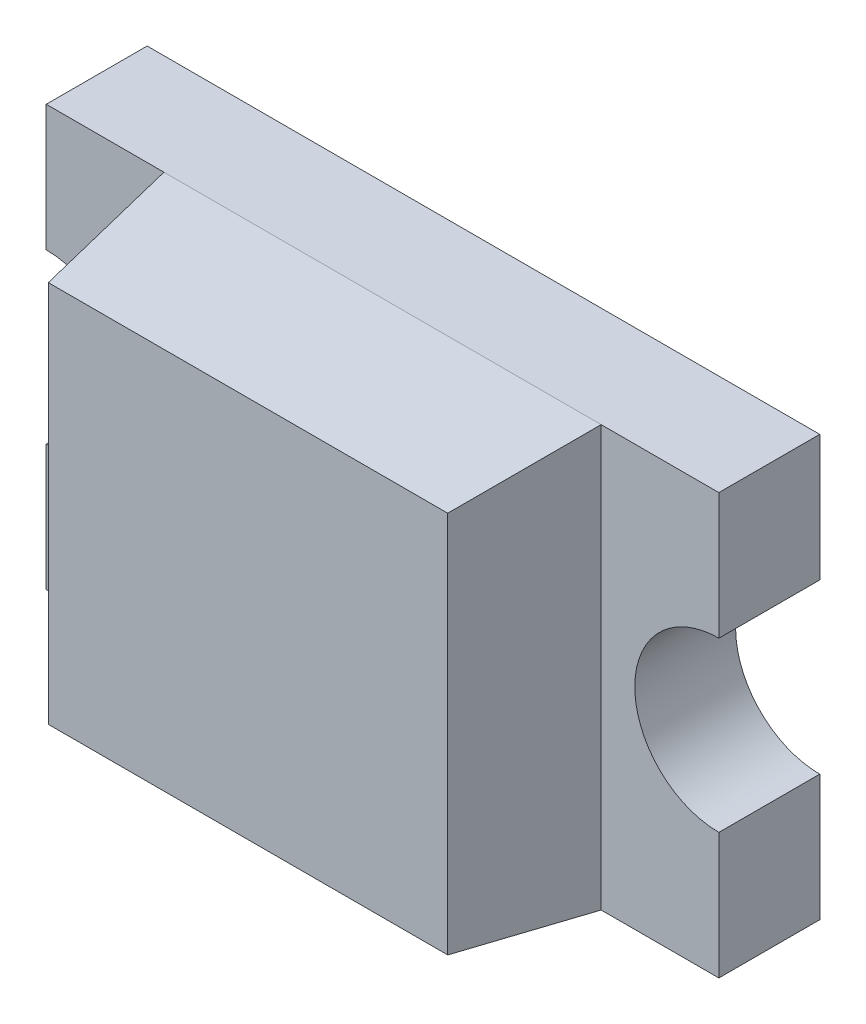
ISO-10303-21;
HEADER;
FILE_DESCRIPTION(('STEP AP214'),'2;1');
FILE_NAME('part.step','',(''),(''),'','','');
FILE_SCHEMA(('AUTOMOTIVE_DESIGN { 1 0 10303 214 1 1 1 1 }'));
ENDSEC;
DATA;
#1=APPLICATION_CONTEXT('core data for automotive mechanical design processes');
#2=APPLICATION_PROTOCOL_DEFINITION('international standard','automotive_design',2000,#1);
#3=PRODUCT_CONTEXT('',#1,'mechanical');
#4=PRODUCT('Part','Part','',(#3));
#5=PRODUCT_RELATED_PRODUCT_CATEGORY('part','',(#4));
#6=PRODUCT_DEFINITION_FORMATION('','',#4);
#7=PRODUCT_DEFINITION_CONTEXT('part definition',#1,'design');
#8=PRODUCT_DEFINITION('design','',#6,#7);
#9=PRODUCT_DEFINITION_SHAPE('','',#8);
#10=(LENGTH_UNIT() NAMED_UNIT(*) SI_UNIT(.MILLI.,.METRE.));
#11=(NAMED_UNIT(*) PLANE_ANGLE_UNIT() SI_UNIT($,.RADIAN.));
#12=(NAMED_UNIT(*) SI_UNIT($,.STERADIAN.) SOLID_ANGLE_UNIT());
#13=UNCERTAINTY_MEASURE_WITH_UNIT(LENGTH_MEASURE(1.E-05),#10,'distance_accuracy_value','');
#14=(GEOMETRIC_REPRESENTATION_CONTEXT(3) GLOBAL_UNCERTAINTY_ASSIGNED_CONTEXT((#13)) GLOBAL_UNIT_ASSIGNED_CONTEXT((#10,
#11,#12)) REPRESENTATION_CONTEXT('',''));
#15=CARTESIAN_POINT('',(0.,0.,0.));
#16=DIRECTION('',(0.,0.,1.));
#17=DIRECTION('',(1.,0.,0.));
#18=AXIS2_PLACEMENT_3D('',#15,#16,#17);
#19=CARTESIAN_POINT('',(-0.65139173101,0.635,0.290097319313));
#20=CARTESIAN_POINT('',(-0.592391935109,0.635,0.709902680687));
#21=CARTESIAN_POINT('',(-0.65139173101,-0.635,0.290097319313));
#22=CARTESIAN_POINT('',(-0.592391935109,-0.635,0.709902680687));
#23=(BOUNDED_SURFACE() B_SPLINE_SURFACE(1,1,((#19,#20),(#21,#22)),.UNSPECIFIED.,.F.,.F.,
.F.) B_SPLINE_SURFACE_WITH_KNOTS((2,2),(2,2),(-0.126,0.001),(-0.001,0.04139310290074),
.UNSPECIFIED.) GEOMETRIC_REPRESENTATION_ITEM() RATIONAL_B_SPLINE_SURFACE(((1.,1.),(1.,1.))) REPRESENTATION_ITEM('') SURFACE());
#24=CARTESIAN_POINT('',(-0.593783666119,-0.568783666119,0.7));
#25=CARTESIAN_POINT('',(-0.593783666119,0.568783666119,0.7));
#26=(BOUNDED_CURVE() B_SPLINE_CURVE(1,(#24,#25),.UNSPECIFIED.,.F.,
.F.) B_SPLINE_CURVE_WITH_KNOTS((2,2),(0.005621633388096,0.119378366612),
.UNSPECIFIED.) CURVE() GEOMETRIC_REPRESENTATION_ITEM() RATIONAL_B_SPLINE_CURVE((1.,1.)) REPRESENTATION_ITEM(''));
#27=CARTESIAN_POINT('',(-0.593783666119,-0.568783666119,0.7));
#28=VERTEX_POINT('',#27);
#29=CARTESIAN_POINT('',(-0.593783666119,0.568783666119,0.7));
#30=VERTEX_POINT('',#29);
#31=EDGE_CURVE('E381',#28,#30,#26,.T.);
#32=CARTESIAN_POINT('',(-0.65,0.625,0.3));
#33=CARTESIAN_POINT('',(-0.593783666119,0.568783666119,0.7));
#34=(BOUNDED_CURVE() B_SPLINE_CURVE(1,(#32,#33),.UNSPECIFIED.,.F.,
.F.) B_SPLINE_CURVE_WITH_KNOTS((2,2),(-0.008615283593227,0.03216713325399),
.UNSPECIFIED.) CURVE() GEOMETRIC_REPRESENTATION_ITEM() RATIONAL_B_SPLINE_CURVE((1.,1.)) REPRESENTATION_ITEM(''));
#35=CARTESIAN_POINT('',(-0.65,0.625,0.3));
#36=VERTEX_POINT('',#35);
#37=EDGE_CURVE('E11',#36,#30,#34,.T.);
#38=CARTESIAN_POINT('',(-0.65,-0.625,0.3));
#39=CARTESIAN_POINT('',(-0.65,0.625,0.3));
#40=(BOUNDED_CURVE() B_SPLINE_CURVE(1,(#38,#39),.UNSPECIFIED.,.F.,
.F.) B_SPLINE_CURVE_WITH_KNOTS((2,2),(-0.03125,0.09375),
.UNSPECIFIED.) CURVE() GEOMETRIC_REPRESENTATION_ITEM() RATIONAL_B_SPLINE_CURVE((1.,1.)) REPRESENTATION_ITEM(''));
#41=CARTESIAN_POINT('',(-0.65,-0.625,0.3));
#42=VERTEX_POINT('',#41);
#43=EDGE_CURVE('E130',#42,#36,#40,.T.);
#44=CARTESIAN_POINT('',(-0.65,-0.625,0.3));
#45=CARTESIAN_POINT('',(-0.593783666119,-0.568783666119,0.7));
#46=(BOUNDED_CURVE() B_SPLINE_CURVE(1,(#44,#45),.UNSPECIFIED.,.F.,
.F.) B_SPLINE_CURVE_WITH_KNOTS((2,2),(-0.008959894936956,0.03182252191026),
.UNSPECIFIED.) CURVE() GEOMETRIC_REPRESENTATION_ITEM() RATIONAL_B_SPLINE_CURVE((1.,1.)) REPRESENTATION_ITEM(''));
#47=EDGE_CURVE('E119',#42,#28,#46,.T.);
#48=ORIENTED_EDGE('',*,*,#31,.T.);
#49=ORIENTED_EDGE('',*,*,#37,.F.);
#50=ORIENTED_EDGE('',*,*,#43,.F.);
#51=ORIENTED_EDGE('',*,*,#47,.T.);
#52=EDGE_LOOP('',(#48,#49,#50,#51));
#53=FACE_BOUND('',#52,.T.);
#54=ADVANCED_FACE('F17',(#53),#23,.T.);
#55=CARTESIAN_POINT('',(0.66,0.62639173101,0.290097319313));
#56=CARTESIAN_POINT('',(0.66,0.567391935109,0.709902680687));
#57=CARTESIAN_POINT('',(-0.66,0.62639173101,0.290097319313));
#58=CARTESIAN_POINT('',(-0.66,0.567391935109,0.709902680687));
#59=(BOUNDED_SURFACE() B_SPLINE_SURFACE(1,1,((#55,#56),(#57,#58)),.UNSPECIFIED.,.F.,.F.,
.F.) B_SPLINE_SURFACE_WITH_KNOTS((2,2),(2,2),(-0.131,0.001),(-0.001,0.04139310290074),
.UNSPECIFIED.) GEOMETRIC_REPRESENTATION_ITEM() RATIONAL_B_SPLINE_SURFACE(((1.,1.),(1.,1.))) REPRESENTATION_ITEM('') SURFACE());
#60=CARTESIAN_POINT('',(-0.593783666119,0.568783666119,0.7));
#61=CARTESIAN_POINT('',(0.593783666119,0.568783666119,0.7));
#62=(BOUNDED_CURVE() B_SPLINE_CURVE(1,(#60,#61),.UNSPECIFIED.,.F.,
.F.) B_SPLINE_CURVE_WITH_KNOTS((2,2),(0.005621633388096,0.124378366612),
.UNSPECIFIED.) CURVE() GEOMETRIC_REPRESENTATION_ITEM() RATIONAL_B_SPLINE_CURVE((1.,1.)) REPRESENTATION_ITEM(''));
#63=CARTESIAN_POINT('',(0.593783666119,0.568783666119,0.7));
#64=VERTEX_POINT('',#63);
#65=EDGE_CURVE('E175',#30,#64,#62,.T.);
#66=CARTESIAN_POINT('',(0.65,0.625,0.3));
#67=CARTESIAN_POINT('',(0.593783666119,0.568783666119,0.7));
#68=(BOUNDED_CURVE() B_SPLINE_CURVE(1,(#66,#67),.UNSPECIFIED.,.F.,
.F.) B_SPLINE_CURVE_WITH_KNOTS((2,2),(-0.008959894936956,0.03182252191026),
.UNSPECIFIED.) CURVE() GEOMETRIC_REPRESENTATION_ITEM() RATIONAL_B_SPLINE_CURVE((1.,1.)) REPRESENTATION_ITEM(''));
#69=CARTESIAN_POINT('',(0.65,0.625,0.3));
#70=VERTEX_POINT('',#69);
#71=EDGE_CURVE('E23',#70,#64,#68,.T.);
#72=CARTESIAN_POINT('',(0.65,0.625,0.3));
#73=CARTESIAN_POINT('',(-0.65,0.625,0.3));
#74=(BOUNDED_CURVE() B_SPLINE_CURVE(1,(#72,#73),.UNSPECIFIED.,.F.,
.F.) B_SPLINE_CURVE_WITH_KNOTS((2,2),(0.035,0.165),
.UNSPECIFIED.) CURVE() GEOMETRIC_REPRESENTATION_ITEM() RATIONAL_B_SPLINE_CURVE((1.,1.)) REPRESENTATION_ITEM(''));
#75=EDGE_CURVE('E227',#70,#36,#74,.T.);
#76=ORIENTED_EDGE('',*,*,#65,.T.);
#77=ORIENTED_EDGE('',*,*,#71,.F.);
#78=ORIENTED_EDGE('',*,*,#75,.T.);
#79=ORIENTED_EDGE('',*,*,#37,.T.);
#80=EDGE_LOOP('',(#76,#77,#78,#79));
#81=FACE_BOUND('',#80,.T.);
#82=ADVANCED_FACE('F535',(#81),#59,.T.);
#83=CARTESIAN_POINT('',(0.65139173101,-0.635,0.290097319313));
#84=CARTESIAN_POINT('',(0.592391935109,-0.635,0.709902680687));
#85=CARTESIAN_POINT('',(0.65139173101,0.635,0.290097319313));
#86=CARTESIAN_POINT('',(0.592391935109,0.635,0.709902680687));
#87=(BOUNDED_SURFACE() B_SPLINE_SURFACE(1,1,((#83,#84),(#85,#86)),.UNSPECIFIED.,.F.,.F.,
.F.) B_SPLINE_SURFACE_WITH_KNOTS((2,2),(2,2),(-0.126,0.001),(-0.001,0.04139310290074),
.UNSPECIFIED.) GEOMETRIC_REPRESENTATION_ITEM() RATIONAL_B_SPLINE_SURFACE(((1.,1.),(1.,1.))) REPRESENTATION_ITEM('') SURFACE());
#88=CARTESIAN_POINT('',(0.593783666119,0.568783666119,0.7));
#89=CARTESIAN_POINT('',(0.593783666119,-0.568783666119,0.7));
#90=(BOUNDED_CURVE() B_SPLINE_CURVE(1,(#88,#89),.UNSPECIFIED.,.F.,
.F.) B_SPLINE_CURVE_WITH_KNOTS((2,2),(0.005621633388096,0.119378366612),
.UNSPECIFIED.) CURVE() GEOMETRIC_REPRESENTATION_ITEM() RATIONAL_B_SPLINE_CURVE((1.,1.)) REPRESENTATION_ITEM(''));
#91=CARTESIAN_POINT('',(0.593783666119,-0.568783666119,0.7));
#92=VERTEX_POINT('',#91);
#93=EDGE_CURVE('E113',#64,#92,#90,.T.);
#94=CARTESIAN_POINT('',(0.65,-0.625,0.3));
#95=CARTESIAN_POINT('',(0.593783666119,-0.568783666119,0.7));
#96=(BOUNDED_CURVE() B_SPLINE_CURVE(1,(#94,#95),.UNSPECIFIED.,.F.,
.F.) B_SPLINE_CURVE_WITH_KNOTS((2,2),(-0.008615283593227,0.03216713325399),
.UNSPECIFIED.) CURVE() GEOMETRIC_REPRESENTATION_ITEM() RATIONAL_B_SPLINE_CURVE((1.,1.)) REPRESENTATION_ITEM(''));
#97=CARTESIAN_POINT('',(0.65,-0.625,0.3));
#98=VERTEX_POINT('',#97);
#99=EDGE_CURVE('E107',#98,#92,#96,.T.);
#100=CARTESIAN_POINT('',(0.65,0.625,0.3));
#101=CARTESIAN_POINT('',(0.65,-0.625,0.3));
#102=(BOUNDED_CURVE() B_SPLINE_CURVE(1,(#100,#101),.UNSPECIFIED.,.F.,
.F.) B_SPLINE_CURVE_WITH_KNOTS((2,2),(-0.03125,0.09375),
.UNSPECIFIED.) CURVE() GEOMETRIC_REPRESENTATION_ITEM() RATIONAL_B_SPLINE_CURVE((1.,1.)) REPRESENTATION_ITEM(''));
#103=EDGE_CURVE('E110',#70,#98,#102,.T.);
#104=ORIENTED_EDGE('',*,*,#93,.T.);
#105=ORIENTED_EDGE('',*,*,#99,.F.);
#106=ORIENTED_EDGE('',*,*,#103,.F.);
#107=ORIENTED_EDGE('',*,*,#71,.T.);
#108=EDGE_LOOP('',(#104,#105,#106,#107));
#109=FACE_BOUND('',#108,.T.);
#110=ADVANCED_FACE('F109',(#109),#87,.T.);
#111=CARTESIAN_POINT('',(-0.66,-0.62639173101,0.290097319313));
#112=CARTESIAN_POINT('',(-0.66,-0.567391935109,0.709902680687));
#113=CARTESIAN_POINT('',(0.66,-0.62639173101,0.290097319313));
#114=CARTESIAN_POINT('',(0.66,-0.567391935109,0.709902680687));
#115=(BOUNDED_SURFACE() B_SPLINE_SURFACE(1,1,((#111,#112),(#113,#114)),.UNSPECIFIED.,.F.,.F.,
.F.) B_SPLINE_SURFACE_WITH_KNOTS((2,2),(2,2),(-0.131,0.001),(-0.001,0.04139310290074),
.UNSPECIFIED.) GEOMETRIC_REPRESENTATION_ITEM() RATIONAL_B_SPLINE_SURFACE(((1.,1.),(1.,1.))) REPRESENTATION_ITEM('') SURFACE());
#116=CARTESIAN_POINT('',(0.593783666119,-0.568783666119,0.7));
#117=CARTESIAN_POINT('',(-0.593783666119,-0.568783666119,0.7));
#118=(BOUNDED_CURVE() B_SPLINE_CURVE(1,(#116,#117),.UNSPECIFIED.,.F.,
.F.) B_SPLINE_CURVE_WITH_KNOTS((2,2),(0.005621633388096,0.124378366612),
.UNSPECIFIED.) CURVE() GEOMETRIC_REPRESENTATION_ITEM() RATIONAL_B_SPLINE_CURVE((1.,1.)) REPRESENTATION_ITEM(''));
#119=EDGE_CURVE('E332',#92,#28,#118,.T.);
#120=CARTESIAN_POINT('',(-0.65,-0.625,0.3));
#121=CARTESIAN_POINT('',(0.65,-0.625,0.3));
#122=(BOUNDED_CURVE() B_SPLINE_CURVE(1,(#120,#121),.UNSPECIFIED.,.F.,
.F.) B_SPLINE_CURVE_WITH_KNOTS((2,2),(0.035,0.165),
.UNSPECIFIED.) CURVE() GEOMETRIC_REPRESENTATION_ITEM() RATIONAL_B_SPLINE_CURVE((1.,1.)) REPRESENTATION_ITEM(''));
#123=EDGE_CURVE('E134',#42,#98,#122,.T.);
#124=ORIENTED_EDGE('',*,*,#119,.T.);
#125=ORIENTED_EDGE('',*,*,#47,.F.);
#126=ORIENTED_EDGE('',*,*,#123,.T.);
#127=ORIENTED_EDGE('',*,*,#99,.T.);
#128=EDGE_LOOP('',(#124,#125,#126,#127));
#129=FACE_BOUND('',#128,.T.);
#130=ADVANCED_FACE('F135',(#129),#115,.T.);
#131=CARTESIAN_POINT('',(0.603783666119,0.578783666119,0.7));
#132=CARTESIAN_POINT('',(0.603783666119,-0.578783666119,0.7));
#133=CARTESIAN_POINT('',(-0.603783666119,0.578783666119,0.7));
#134=CARTESIAN_POINT('',(-0.603783666119,-0.578783666119,0.7));
#135=(BOUNDED_SURFACE() B_SPLINE_SURFACE(1,1,((#131,#132),(#133,#134)),.UNSPECIFIED.,.F.,.F.,
.F.) B_SPLINE_SURFACE_WITH_KNOTS((2,2),(2,2),(-0.0603783666119,0.0603783666119),
(-0.0578783666119,0.0578783666119),
.UNSPECIFIED.) GEOMETRIC_REPRESENTATION_ITEM() RATIONAL_B_SPLINE_SURFACE(((1.,1.),(1.,1.))) REPRESENTATION_ITEM('') SURFACE());
#136=ORIENTED_EDGE('',*,*,#31,.F.);
#137=ORIENTED_EDGE('',*,*,#119,.F.);
#138=ORIENTED_EDGE('',*,*,#93,.F.);
#139=ORIENTED_EDGE('',*,*,#65,.F.);
#140=EDGE_LOOP('',(#136,#137,#138,#139));
#141=FACE_BOUND('',#140,.T.);
#142=ADVANCED_FACE('F492',(#141),#135,.T.);
#143=CARTESIAN_POINT('',(-1.01,-0.635,0.3));
#144=CARTESIAN_POINT('',(-1.01,0.635,0.3));
#145=CARTESIAN_POINT('',(-0.64,-0.635,0.3));
#146=CARTESIAN_POINT('',(-0.64,0.635,0.3));
#147=(BOUNDED_SURFACE() B_SPLINE_SURFACE(1,1,((#143,#144),(#145,#146)),.UNSPECIFIED.,.F.,.F.,
.F.) B_SPLINE_SURFACE_WITH_KNOTS((2,2),(2,2),(-0.101,-0.064),(-0.0635,0.0635),
.UNSPECIFIED.) GEOMETRIC_REPRESENTATION_ITEM() RATIONAL_B_SPLINE_SURFACE(((1.,1.),(1.,1.))) REPRESENTATION_ITEM('') SURFACE());
#148=CARTESIAN_POINT('',(-0.65,0.625,0.3));
#149=CARTESIAN_POINT('',(-1.,0.625,0.3));
#150=(BOUNDED_CURVE() B_SPLINE_CURVE(1,(#148,#149),.UNSPECIFIED.,.F.,
.F.) B_SPLINE_CURVE_WITH_KNOTS((2,2),(0.165,0.2),
.UNSPECIFIED.) CURVE() GEOMETRIC_REPRESENTATION_ITEM() RATIONAL_B_SPLINE_CURVE((1.,1.)) REPRESENTATION_ITEM(''));
#151=CARTESIAN_POINT('',(-1.,0.625,0.3));
#152=VERTEX_POINT('',#151);
#153=EDGE_CURVE('E236',#36,#152,#150,.T.);
#154=CARTESIAN_POINT('',(-1.,0.625,0.3));
#155=CARTESIAN_POINT('',(-1.,0.25,0.3));
#156=(BOUNDED_CURVE() B_SPLINE_CURVE(1,(#154,#155),.UNSPECIFIED.,.F.,
.F.) B_SPLINE_CURVE_WITH_KNOTS((2,2),(0.,0.0375),
.UNSPECIFIED.) CURVE() GEOMETRIC_REPRESENTATION_ITEM() RATIONAL_B_SPLINE_CURVE((1.,1.)) REPRESENTATION_ITEM(''));
#157=CARTESIAN_POINT('',(-1.,0.25,0.3));
#158=VERTEX_POINT('',#157);
#159=EDGE_CURVE('E185',#152,#158,#156,.T.);
#160=CARTESIAN_POINT('',(-1.,0.25,0.3));
#161=CARTESIAN_POINT('',(-0.75,0.25,0.3));
#162=CARTESIAN_POINT('',(-0.75,0.,0.3));
#163=CARTESIAN_POINT('',(-0.75,-0.25,0.3));
#164=CARTESIAN_POINT('',(-1.,-0.25,0.3));
#165=(BOUNDED_CURVE() B_SPLINE_CURVE(2,(#160,#161,#162,#163,#164),.UNSPECIFIED.,.F.,
.F.) B_SPLINE_CURVE_WITH_KNOTS((3,2,3),(-3.14159265359,-1.570796326795,0.),
.UNSPECIFIED.) CURVE() GEOMETRIC_REPRESENTATION_ITEM() RATIONAL_B_SPLINE_CURVE((1.,
0.707106781187,1.,0.707106781187,1.)) REPRESENTATION_ITEM(''));
#166=CARTESIAN_POINT('',(-1.,-0.25,0.3));
#167=VERTEX_POINT('',#166);
#168=EDGE_CURVE('E156',#158,#167,#165,.T.);
#169=CARTESIAN_POINT('',(-1.,-0.25,0.3));
#170=CARTESIAN_POINT('',(-1.,-0.625,0.3));
#171=(BOUNDED_CURVE() B_SPLINE_CURVE(1,(#169,#170),.UNSPECIFIED.,.F.,
.F.) B_SPLINE_CURVE_WITH_KNOTS((2,2),(0.,0.0375),
.UNSPECIFIED.) CURVE() GEOMETRIC_REPRESENTATION_ITEM() RATIONAL_B_SPLINE_CURVE((1.,1.)) REPRESENTATION_ITEM(''));
#172=CARTESIAN_POINT('',(-1.,-0.625,0.3));
#173=VERTEX_POINT('',#172);
#174=EDGE_CURVE('E150',#167,#173,#171,.T.);
#175=CARTESIAN_POINT('',(-1.,-0.625,0.3));
#176=CARTESIAN_POINT('',(-0.65,-0.625,0.3));
#177=(BOUNDED_CURVE() B_SPLINE_CURVE(1,(#175,#176),.UNSPECIFIED.,.F.,
.F.) B_SPLINE_CURVE_WITH_KNOTS((2,2),(0.,0.035),
.UNSPECIFIED.) CURVE() GEOMETRIC_REPRESENTATION_ITEM() RATIONAL_B_SPLINE_CURVE((1.,1.)) REPRESENTATION_ITEM(''));
#178=EDGE_CURVE('E140',#173,#42,#177,.T.);
#179=ORIENTED_EDGE('',*,*,#43,.T.);
#180=ORIENTED_EDGE('',*,*,#153,.T.);
#181=ORIENTED_EDGE('',*,*,#159,.T.);
#182=ORIENTED_EDGE('',*,*,#168,.T.);
#183=ORIENTED_EDGE('',*,*,#174,.T.);
#184=ORIENTED_EDGE('',*,*,#178,.T.);
#185=EDGE_LOOP('',(#179,#180,#181,#182,#183,#184));
#186=FACE_BOUND('',#185,.T.);
#187=ADVANCED_FACE('F19',(#186),#147,.T.);
#188=CARTESIAN_POINT('',(0.64,-0.635,0.3));
#189=CARTESIAN_POINT('',(0.64,0.635,0.3));
#190=CARTESIAN_POINT('',(1.01,-0.635,0.3));
#191=CARTESIAN_POINT('',(1.01,0.635,0.3));
#192=(BOUNDED_SURFACE() B_SPLINE_SURFACE(1,1,((#188,#189),(#190,#191)),.UNSPECIFIED.,.F.,.F.,
.F.) B_SPLINE_SURFACE_WITH_KNOTS((2,2),(2,2),(0.064,0.101),(-0.0635,0.0635),
.UNSPECIFIED.) GEOMETRIC_REPRESENTATION_ITEM() RATIONAL_B_SPLINE_SURFACE(((1.,1.),(1.,1.))) REPRESENTATION_ITEM('') SURFACE());
#193=CARTESIAN_POINT('',(0.65,-0.625,0.3));
#194=CARTESIAN_POINT('',(1.,-0.625,0.3));
#195=(BOUNDED_CURVE() B_SPLINE_CURVE(1,(#193,#194),.UNSPECIFIED.,.F.,
.F.) B_SPLINE_CURVE_WITH_KNOTS((2,2),(0.165,0.2),
.UNSPECIFIED.) CURVE() GEOMETRIC_REPRESENTATION_ITEM() RATIONAL_B_SPLINE_CURVE((1.,1.)) REPRESENTATION_ITEM(''));
#196=CARTESIAN_POINT('',(1.,-0.625,0.3));
#197=VERTEX_POINT('',#196);
#198=EDGE_CURVE('E124',#98,#197,#195,.T.);
#199=CARTESIAN_POINT('',(1.,-0.625,0.3));
#200=CARTESIAN_POINT('',(1.,-0.25,0.3));
#201=(BOUNDED_CURVE() B_SPLINE_CURVE(1,(#199,#200),.UNSPECIFIED.,.F.,
.F.) B_SPLINE_CURVE_WITH_KNOTS((2,2),(0.,0.0375),
.UNSPECIFIED.) CURVE() GEOMETRIC_REPRESENTATION_ITEM() RATIONAL_B_SPLINE_CURVE((1.,1.)) REPRESENTATION_ITEM(''));
#202=CARTESIAN_POINT('',(1.,-0.25,0.3));
#203=VERTEX_POINT('',#202);
#204=EDGE_CURVE('E102',#197,#203,#201,.T.);
#205=CARTESIAN_POINT('',(1.,-0.25,0.3));
#206=CARTESIAN_POINT('',(0.75,-0.25,0.3));
#207=CARTESIAN_POINT('',(0.75,0.,0.3));
#208=CARTESIAN_POINT('',(0.75,0.25,0.3));
#209=CARTESIAN_POINT('',(1.,0.25,0.3));
#210=(BOUNDED_CURVE() B_SPLINE_CURVE(2,(#205,#206,#207,#208,#209),.UNSPECIFIED.,.F.,
.F.) B_SPLINE_CURVE_WITH_KNOTS((3,2,3),(-3.14159265359,-1.570796326795,0.),
.UNSPECIFIED.) CURVE() GEOMETRIC_REPRESENTATION_ITEM() RATIONAL_B_SPLINE_CURVE((1.,
0.707106781187,1.,0.707106781187,1.)) REPRESENTATION_ITEM(''));
#211=CARTESIAN_POINT('',(1.,0.25,0.3));
#212=VERTEX_POINT('',#211);
#213=EDGE_CURVE('E131',#203,#212,#210,.T.);
#214=CARTESIAN_POINT('',(1.,0.25,0.3));
#215=CARTESIAN_POINT('',(1.,0.625,0.3));
#216=(BOUNDED_CURVE() B_SPLINE_CURVE(1,(#214,#215),.UNSPECIFIED.,.F.,
.F.) B_SPLINE_CURVE_WITH_KNOTS((2,2),(0.,0.0375),
.UNSPECIFIED.) CURVE() GEOMETRIC_REPRESENTATION_ITEM() RATIONAL_B_SPLINE_CURVE((1.,1.)) REPRESENTATION_ITEM(''));
#217=CARTESIAN_POINT('',(1.,0.625,0.3));
#218=VERTEX_POINT('',#217);
#219=EDGE_CURVE('E205',#212,#218,#216,.T.);
#220=CARTESIAN_POINT('',(1.,0.625,0.3));
#221=CARTESIAN_POINT('',(0.65,0.625,0.3));
#222=(BOUNDED_CURVE() B_SPLINE_CURVE(1,(#220,#221),.UNSPECIFIED.,.F.,
.F.) B_SPLINE_CURVE_WITH_KNOTS((2,2),(0.,0.035),
.UNSPECIFIED.) CURVE() GEOMETRIC_REPRESENTATION_ITEM() RATIONAL_B_SPLINE_CURVE((1.,1.)) REPRESENTATION_ITEM(''));
#223=EDGE_CURVE('E127',#218,#70,#222,.T.);
#224=ORIENTED_EDGE('',*,*,#103,.T.);
#225=ORIENTED_EDGE('',*,*,#198,.T.);
#226=ORIENTED_EDGE('',*,*,#204,.T.);
#227=ORIENTED_EDGE('',*,*,#213,.T.);
#228=ORIENTED_EDGE('',*,*,#219,.T.);
#229=ORIENTED_EDGE('',*,*,#223,.T.);
#230=EDGE_LOOP('',(#224,#225,#226,#227,#228,#229));
#231=FACE_BOUND('',#230,.T.);
#232=ADVANCED_FACE('F122',(#231),#192,.T.);
#233=CARTESIAN_POINT('',(1.,0.25,0.));
#234=CARTESIAN_POINT('',(0.75,0.25,0.));
#235=CARTESIAN_POINT('',(0.75,0.,0.));
#236=CARTESIAN_POINT('',(0.75,-0.25,0.));
#237=CARTESIAN_POINT('',(1.,-0.25,0.));
#238=CARTESIAN_POINT('',(1.,0.25,0.3));
#239=CARTESIAN_POINT('',(0.75,0.25,0.3));
#240=CARTESIAN_POINT('',(0.75,0.,0.3));
#241=CARTESIAN_POINT('',(0.75,-0.25,0.3));
#242=CARTESIAN_POINT('',(1.,-0.25,0.3));
#243=(BOUNDED_SURFACE() B_SPLINE_SURFACE(1,2,((#233,#234,#235,#236,#237),(#238,#239,#240,#241,
#242)),.UNSPECIFIED.,.F.,.F.,.F.) B_SPLINE_SURFACE_WITH_KNOTS((2,2),(3,2,3),(0.,1.2),(0.,
1.570796326795,3.14159265359),
.UNSPECIFIED.) GEOMETRIC_REPRESENTATION_ITEM() RATIONAL_B_SPLINE_SURFACE(((1.,0.707106781187,1.,
0.707106781187,1.),(1.,0.707106781187,1.,0.707106781187,1.))) REPRESENTATION_ITEM('') SURFACE());
#244=CARTESIAN_POINT('',(1.,0.25,0.));
#245=CARTESIAN_POINT('',(0.75,0.25,0.));
#246=CARTESIAN_POINT('',(0.75,0.,0.));
#247=CARTESIAN_POINT('',(0.75,-0.25,0.));
#248=CARTESIAN_POINT('',(1.,-0.25,0.));
#249=(BOUNDED_CURVE() B_SPLINE_CURVE(2,(#244,#245,#246,#247,#248),.UNSPECIFIED.,.F.,
.F.) B_SPLINE_CURVE_WITH_KNOTS((3,2,3),(0.,1.570796326795,3.14159265359),
.UNSPECIFIED.) CURVE() GEOMETRIC_REPRESENTATION_ITEM() RATIONAL_B_SPLINE_CURVE((1.,
0.707106781187,1.,0.707106781187,1.)) REPRESENTATION_ITEM(''));
#250=CARTESIAN_POINT('',(1.,0.25,0.));
#251=VERTEX_POINT('',#250);
#252=CARTESIAN_POINT('',(1.,-0.25,0.));
#253=VERTEX_POINT('',#252);
#254=EDGE_CURVE('E196',#251,#253,#249,.T.);
#255=CARTESIAN_POINT('',(1.,0.25,0.));
#256=CARTESIAN_POINT('',(1.,0.25,0.3));
#257=(BOUNDED_CURVE() B_SPLINE_CURVE(1,(#255,#256),.UNSPECIFIED.,.F.,
.F.) B_SPLINE_CURVE_WITH_KNOTS((2,2),(0.,0.03),
.UNSPECIFIED.) CURVE() GEOMETRIC_REPRESENTATION_ITEM() RATIONAL_B_SPLINE_CURVE((1.,1.)) REPRESENTATION_ITEM(''));
#258=EDGE_CURVE('E254',#251,#212,#257,.T.);
#259=CARTESIAN_POINT('',(1.,-0.25,0.));
#260=CARTESIAN_POINT('',(1.,-0.25,0.3));
#261=(BOUNDED_CURVE() B_SPLINE_CURVE(1,(#259,#260),.UNSPECIFIED.,.F.,
.F.) B_SPLINE_CURVE_WITH_KNOTS((2,2),(0.,0.03),
.UNSPECIFIED.) CURVE() GEOMETRIC_REPRESENTATION_ITEM() RATIONAL_B_SPLINE_CURVE((1.,1.)) REPRESENTATION_ITEM(''));
#262=EDGE_CURVE('E167',#253,#203,#261,.T.);
#263=ORIENTED_EDGE('',*,*,#254,.F.);
#264=ORIENTED_EDGE('',*,*,#258,.T.);
#265=ORIENTED_EDGE('',*,*,#213,.F.);
#266=ORIENTED_EDGE('',*,*,#262,.F.);
#267=EDGE_LOOP('',(#263,#264,#265,#266));
#268=FACE_BOUND('',#267,.T.);
#269=ADVANCED_FACE('F504',(#268),#243,.T.);
#270=CARTESIAN_POINT('',(1.,-0.635,-0.01));
#271=CARTESIAN_POINT('',(1.,-0.635,0.31));
#272=CARTESIAN_POINT('',(1.,-0.24,-0.01));
#273=CARTESIAN_POINT('',(1.,-0.24,0.31));
#274=(BOUNDED_SURFACE() B_SPLINE_SURFACE(1,1,((#270,#271),(#272,#273)),.UNSPECIFIED.,.F.,.F.,
.F.) B_SPLINE_SURFACE_WITH_KNOTS((2,2),(2,2),(-0.001,0.0385),(-0.001,0.031),
.UNSPECIFIED.) GEOMETRIC_REPRESENTATION_ITEM() RATIONAL_B_SPLINE_SURFACE(((1.,1.),(1.,1.))) REPRESENTATION_ITEM('') SURFACE());
#275=CARTESIAN_POINT('',(1.,-0.625,0.));
#276=CARTESIAN_POINT('',(1.,-0.25,0.));
#277=(BOUNDED_CURVE() B_SPLINE_CURVE(1,(#275,#276),.UNSPECIFIED.,.F.,
.F.) B_SPLINE_CURVE_WITH_KNOTS((2,2),(0.,0.0375),
.UNSPECIFIED.) CURVE() GEOMETRIC_REPRESENTATION_ITEM() RATIONAL_B_SPLINE_CURVE((1.,1.)) REPRESENTATION_ITEM(''));
#278=CARTESIAN_POINT('',(1.,-0.625,0.));
#279=VERTEX_POINT('',#278);
#280=EDGE_CURVE('E186',#279,#253,#277,.T.);
#281=CARTESIAN_POINT('',(1.,-0.625,0.));
#282=CARTESIAN_POINT('',(1.,-0.625,0.3));
#283=(BOUNDED_CURVE() B_SPLINE_CURVE(1,(#281,#282),.UNSPECIFIED.,.F.,
.F.) B_SPLINE_CURVE_WITH_KNOTS((2,2),(0.,0.03),
.UNSPECIFIED.) CURVE() GEOMETRIC_REPRESENTATION_ITEM() RATIONAL_B_SPLINE_CURVE((1.,1.)) REPRESENTATION_ITEM(''));
#284=EDGE_CURVE('E143',#279,#197,#283,.T.);
#285=ORIENTED_EDGE('',*,*,#280,.T.);
#286=ORIENTED_EDGE('',*,*,#262,.T.);
#287=ORIENTED_EDGE('',*,*,#204,.F.);
#288=ORIENTED_EDGE('',*,*,#284,.F.);
#289=EDGE_LOOP('',(#285,#286,#287,#288));
#290=FACE_BOUND('',#289,.T.);
#291=ADVANCED_FACE('F500',(#290),#274,.T.);
#292=CARTESIAN_POINT('',(-1.01,-0.625,-0.01));
#293=CARTESIAN_POINT('',(-1.01,-0.625,0.31));
#294=CARTESIAN_POINT('',(1.01,-0.625,-0.01));
#295=CARTESIAN_POINT('',(1.01,-0.625,0.31));
#296=(BOUNDED_SURFACE() B_SPLINE_SURFACE(1,1,((#292,#293),(#294,#295)),.UNSPECIFIED.,.F.,.F.,
.F.) B_SPLINE_SURFACE_WITH_KNOTS((2,2),(2,2),(-0.001,0.201),(-0.001,0.031),
.UNSPECIFIED.) GEOMETRIC_REPRESENTATION_ITEM() RATIONAL_B_SPLINE_SURFACE(((1.,1.),(1.,1.))) REPRESENTATION_ITEM('') SURFACE());
#297=CARTESIAN_POINT('',(-1.,-0.625,0.));
#298=CARTESIAN_POINT('',(1.,-0.625,0.));
#299=(BOUNDED_CURVE() B_SPLINE_CURVE(1,(#297,#298),.UNSPECIFIED.,.F.,
.F.) B_SPLINE_CURVE_WITH_KNOTS((2,2),(0.,0.2),
.UNSPECIFIED.) CURVE() GEOMETRIC_REPRESENTATION_ITEM() RATIONAL_B_SPLINE_CURVE((1.,1.)) REPRESENTATION_ITEM(''));
#300=CARTESIAN_POINT('',(-1.,-0.625,0.));
#301=VERTEX_POINT('',#300);
#302=EDGE_CURVE('E195',#301,#279,#299,.T.);
#303=CARTESIAN_POINT('',(-1.,-0.625,0.));
#304=CARTESIAN_POINT('',(-1.,-0.625,0.3));
#305=(BOUNDED_CURVE() B_SPLINE_CURVE(1,(#303,#304),.UNSPECIFIED.,.F.,
.F.) B_SPLINE_CURVE_WITH_KNOTS((2,2),(0.,0.03),
.UNSPECIFIED.) CURVE() GEOMETRIC_REPRESENTATION_ITEM() RATIONAL_B_SPLINE_CURVE((1.,1.)) REPRESENTATION_ITEM(''));
#306=EDGE_CURVE('E226',#301,#173,#305,.T.);
#307=ORIENTED_EDGE('',*,*,#302,.T.);
#308=ORIENTED_EDGE('',*,*,#284,.T.);
#309=ORIENTED_EDGE('',*,*,#198,.F.);
#310=ORIENTED_EDGE('',*,*,#123,.F.);
#311=ORIENTED_EDGE('',*,*,#178,.F.);
#312=ORIENTED_EDGE('',*,*,#306,.F.);
#313=EDGE_LOOP('',(#307,#308,#309,#310,#311,#312));
#314=FACE_BOUND('',#313,.T.);
#315=ADVANCED_FACE('F142',(#314),#296,.T.);
#316=CARTESIAN_POINT('',(-1.,-0.24,-0.01));
#317=CARTESIAN_POINT('',(-1.,-0.24,0.31));
#318=CARTESIAN_POINT('',(-1.,-0.635,-0.01));
#319=CARTESIAN_POINT('',(-1.,-0.635,0.31));
#320=(BOUNDED_SURFACE() B_SPLINE_SURFACE(1,1,((#316,#317),(#318,#319)),.UNSPECIFIED.,.F.,.F.,
.F.) B_SPLINE_SURFACE_WITH_KNOTS((2,2),(2,2),(-0.001,0.0385),(-0.001,0.031),
.UNSPECIFIED.) GEOMETRIC_REPRESENTATION_ITEM() RATIONAL_B_SPLINE_SURFACE(((1.,1.),(1.,1.))) REPRESENTATION_ITEM('') SURFACE());
#321=CARTESIAN_POINT('',(-1.,-0.25,0.));
#322=CARTESIAN_POINT('',(-1.,-0.625,0.));
#323=(BOUNDED_CURVE() B_SPLINE_CURVE(1,(#321,#322),.UNSPECIFIED.,.F.,
.F.) B_SPLINE_CURVE_WITH_KNOTS((2,2),(0.,0.0375),
.UNSPECIFIED.) CURVE() GEOMETRIC_REPRESENTATION_ITEM() RATIONAL_B_SPLINE_CURVE((1.,1.)) REPRESENTATION_ITEM(''));
#324=CARTESIAN_POINT('',(-1.,-0.25,0.));
#325=VERTEX_POINT('',#324);
#326=EDGE_CURVE('E244',#325,#301,#323,.T.);
#327=CARTESIAN_POINT('',(-1.,-0.25,0.));
#328=CARTESIAN_POINT('',(-1.,-0.25,0.3));
#329=(BOUNDED_CURVE() B_SPLINE_CURVE(1,(#327,#328),.UNSPECIFIED.,.F.,
.F.) B_SPLINE_CURVE_WITH_KNOTS((2,2),(0.,0.03),
.UNSPECIFIED.) CURVE() GEOMETRIC_REPRESENTATION_ITEM() RATIONAL_B_SPLINE_CURVE((1.,1.)) REPRESENTATION_ITEM(''));
#330=EDGE_CURVE('E176',#325,#167,#329,.T.);
#331=ORIENTED_EDGE('',*,*,#326,.T.);
#332=ORIENTED_EDGE('',*,*,#306,.T.);
#333=ORIENTED_EDGE('',*,*,#174,.F.);
#334=ORIENTED_EDGE('',*,*,#330,.F.);
#335=EDGE_LOOP('',(#331,#332,#333,#334));
#336=FACE_BOUND('',#335,.T.);
#337=ADVANCED_FACE('F445',(#336),#320,.T.);
#338=CARTESIAN_POINT('',(-1.,-0.25,0.));
#339=CARTESIAN_POINT('',(-0.75,-0.25,0.));
#340=CARTESIAN_POINT('',(-0.75,0.,0.));
#341=CARTESIAN_POINT('',(-0.75,0.25,0.));
#342=CARTESIAN_POINT('',(-1.,0.25,0.));
#343=CARTESIAN_POINT('',(-1.,-0.25,0.3));
#344=CARTESIAN_POINT('',(-0.75,-0.25,0.3));
#345=CARTESIAN_POINT('',(-0.75,0.,0.3));
#346=CARTESIAN_POINT('',(-0.75,0.25,0.3));
#347=CARTESIAN_POINT('',(-1.,0.25,0.3));
#348=(BOUNDED_SURFACE() B_SPLINE_SURFACE(1,2,((#338,#339,#340,#341,#342),(#343,#344,#345,#346,
#347)),.UNSPECIFIED.,.F.,.F.,.F.) B_SPLINE_SURFACE_WITH_KNOTS((2,2),(3,2,3),(0.,1.2),(0.,
1.570796326795,3.14159265359),
.UNSPECIFIED.) GEOMETRIC_REPRESENTATION_ITEM() RATIONAL_B_SPLINE_SURFACE(((1.,0.707106781187,1.,
0.707106781187,1.),(1.,0.707106781187,1.,0.707106781187,1.))) REPRESENTATION_ITEM('') SURFACE());
#349=CARTESIAN_POINT('',(-1.,-0.25,0.));
#350=CARTESIAN_POINT('',(-0.75,-0.25,0.));
#351=CARTESIAN_POINT('',(-0.75,0.,0.));
#352=CARTESIAN_POINT('',(-0.75,0.25,0.));
#353=CARTESIAN_POINT('',(-1.,0.25,0.));
#354=(BOUNDED_CURVE() B_SPLINE_CURVE(2,(#349,#350,#351,#352,#353),.UNSPECIFIED.,.F.,
.F.) B_SPLINE_CURVE_WITH_KNOTS((3,2,3),(0.,1.570796326795,3.14159265359),
.UNSPECIFIED.) CURVE() GEOMETRIC_REPRESENTATION_ITEM() RATIONAL_B_SPLINE_CURVE((1.,
0.707106781187,1.,0.707106781187,1.)) REPRESENTATION_ITEM(''));
#355=CARTESIAN_POINT('',(-1.,0.25,0.));
#356=VERTEX_POINT('',#355);
#357=EDGE_CURVE('E347',#325,#356,#354,.T.);
#358=CARTESIAN_POINT('',(-1.,0.25,0.));
#359=CARTESIAN_POINT('',(-1.,0.25,0.3));
#360=(BOUNDED_CURVE() B_SPLINE_CURVE(1,(#358,#359),.UNSPECIFIED.,.F.,
.F.) B_SPLINE_CURVE_WITH_KNOTS((2,2),(0.,0.03),
.UNSPECIFIED.) CURVE() GEOMETRIC_REPRESENTATION_ITEM() RATIONAL_B_SPLINE_CURVE((1.,1.)) REPRESENTATION_ITEM(''));
#361=EDGE_CURVE('E245',#356,#158,#360,.T.);
#362=ORIENTED_EDGE('',*,*,#357,.F.);
#363=ORIENTED_EDGE('',*,*,#330,.T.);
#364=ORIENTED_EDGE('',*,*,#168,.F.);
#365=ORIENTED_EDGE('',*,*,#361,.F.);
#366=EDGE_LOOP('',(#362,#363,#364,#365));
#367=FACE_BOUND('',#366,.T.);
#368=ADVANCED_FACE('F513',(#367),#348,.T.);
#369=CARTESIAN_POINT('',(-1.,0.635,-0.01));
#370=CARTESIAN_POINT('',(-1.,0.635,0.31));
#371=CARTESIAN_POINT('',(-1.,0.24,-0.01));
#372=CARTESIAN_POINT('',(-1.,0.24,0.31));
#373=(BOUNDED_SURFACE() B_SPLINE_SURFACE(1,1,((#369,#370),(#371,#372)),.UNSPECIFIED.,.F.,.F.,
.F.) B_SPLINE_SURFACE_WITH_KNOTS((2,2),(2,2),(-0.001,0.0385),(-0.001,0.031),
.UNSPECIFIED.) GEOMETRIC_REPRESENTATION_ITEM() RATIONAL_B_SPLINE_SURFACE(((1.,1.),(1.,1.))) REPRESENTATION_ITEM('') SURFACE());
#374=CARTESIAN_POINT('',(-1.,0.625,0.));
#375=CARTESIAN_POINT('',(-1.,0.25,0.));
#376=(BOUNDED_CURVE() B_SPLINE_CURVE(1,(#374,#375),.UNSPECIFIED.,.F.,
.F.) B_SPLINE_CURVE_WITH_KNOTS((2,2),(0.,0.0375),
.UNSPECIFIED.) CURVE() GEOMETRIC_REPRESENTATION_ITEM() RATIONAL_B_SPLINE_CURVE((1.,1.)) REPRESENTATION_ITEM(''));
#377=CARTESIAN_POINT('',(-1.,0.625,0.));
#378=VERTEX_POINT('',#377);
#379=EDGE_CURVE('E356',#378,#356,#376,.T.);
#380=CARTESIAN_POINT('',(-1.,0.625,0.));
#381=CARTESIAN_POINT('',(-1.,0.625,0.3));
#382=(BOUNDED_CURVE() B_SPLINE_CURVE(1,(#380,#381),.UNSPECIFIED.,.F.,
.F.) B_SPLINE_CURVE_WITH_KNOTS((2,2),(0.,0.03),
.UNSPECIFIED.) CURVE() GEOMETRIC_REPRESENTATION_ITEM() RATIONAL_B_SPLINE_CURVE((1.,1.)) REPRESENTATION_ITEM(''));
#383=EDGE_CURVE('E263',#378,#152,#382,.T.);
#384=ORIENTED_EDGE('',*,*,#379,.T.);
#385=ORIENTED_EDGE('',*,*,#361,.T.);
#386=ORIENTED_EDGE('',*,*,#159,.F.);
#387=ORIENTED_EDGE('',*,*,#383,.F.);
#388=EDGE_LOOP('',(#384,#385,#386,#387));
#389=FACE_BOUND('',#388,.T.);
#390=ADVANCED_FACE('F520',(#389),#373,.T.);
#391=CARTESIAN_POINT('',(1.01,0.625,-0.01));
#392=CARTESIAN_POINT('',(1.01,0.625,0.31));
#393=CARTESIAN_POINT('',(-1.01,0.625,-0.01));
#394=CARTESIAN_POINT('',(-1.01,0.625,0.31));
#395=(BOUNDED_SURFACE() B_SPLINE_SURFACE(1,1,((#391,#392),(#393,#394)),.UNSPECIFIED.,.F.,.F.,
.F.) B_SPLINE_SURFACE_WITH_KNOTS((2,2),(2,2),(-0.001,0.201),(-0.001,0.031),
.UNSPECIFIED.) GEOMETRIC_REPRESENTATION_ITEM() RATIONAL_B_SPLINE_SURFACE(((1.,1.),(1.,1.))) REPRESENTATION_ITEM('') SURFACE());
#396=CARTESIAN_POINT('',(1.,0.625,0.));
#397=CARTESIAN_POINT('',(-1.,0.625,0.));
#398=(BOUNDED_CURVE() B_SPLINE_CURVE(1,(#396,#397),.UNSPECIFIED.,.F.,
.F.) B_SPLINE_CURVE_WITH_KNOTS((2,2),(0.,0.2),
.UNSPECIFIED.) CURVE() GEOMETRIC_REPRESENTATION_ITEM() RATIONAL_B_SPLINE_CURVE((1.,1.)) REPRESENTATION_ITEM(''));
#399=CARTESIAN_POINT('',(1.,0.625,0.));
#400=VERTEX_POINT('',#399);
#401=EDGE_CURVE('E206',#400,#378,#398,.T.);
#402=CARTESIAN_POINT('',(1.,0.625,0.));
#403=CARTESIAN_POINT('',(1.,0.625,0.3));
#404=(BOUNDED_CURVE() B_SPLINE_CURVE(1,(#402,#403),.UNSPECIFIED.,.F.,
.F.) B_SPLINE_CURVE_WITH_KNOTS((2,2),(0.,0.03),
.UNSPECIFIED.) CURVE() GEOMETRIC_REPRESENTATION_ITEM() RATIONAL_B_SPLINE_CURVE((1.,1.)) REPRESENTATION_ITEM(''));
#405=EDGE_CURVE('E197',#400,#218,#404,.T.);
#406=ORIENTED_EDGE('',*,*,#401,.T.);
#407=ORIENTED_EDGE('',*,*,#383,.T.);
#408=ORIENTED_EDGE('',*,*,#153,.F.);
#409=ORIENTED_EDGE('',*,*,#75,.F.);
#410=ORIENTED_EDGE('',*,*,#223,.F.);
#411=ORIENTED_EDGE('',*,*,#405,.F.);
#412=EDGE_LOOP('',(#406,#407,#408,#409,#410,#411));
#413=FACE_BOUND('',#412,.T.);
#414=ADVANCED_FACE('F524',(#413),#395,.T.);
#415=CARTESIAN_POINT('',(1.,0.24,-0.01));
#416=CARTESIAN_POINT('',(1.,0.24,0.31));
#417=CARTESIAN_POINT('',(1.,0.635,-0.01));
#418=CARTESIAN_POINT('',(1.,0.635,0.31));
#419=(BOUNDED_SURFACE() B_SPLINE_SURFACE(1,1,((#415,#416),(#417,#418)),.UNSPECIFIED.,.F.,.F.,
.F.) B_SPLINE_SURFACE_WITH_KNOTS((2,2),(2,2),(-0.001,0.0385),(-0.001,0.031),
.UNSPECIFIED.) GEOMETRIC_REPRESENTATION_ITEM() RATIONAL_B_SPLINE_SURFACE(((1.,1.),(1.,1.))) REPRESENTATION_ITEM('') SURFACE());
#420=CARTESIAN_POINT('',(1.,0.25,0.));
#421=CARTESIAN_POINT('',(1.,0.625,0.));
#422=(BOUNDED_CURVE() B_SPLINE_CURVE(1,(#420,#421),.UNSPECIFIED.,.F.,
.F.) B_SPLINE_CURVE_WITH_KNOTS((2,2),(0.,0.0375),
.UNSPECIFIED.) CURVE() GEOMETRIC_REPRESENTATION_ITEM() RATIONAL_B_SPLINE_CURVE((1.,1.)) REPRESENTATION_ITEM(''));
#423=EDGE_CURVE('E318',#251,#400,#422,.T.);
#424=ORIENTED_EDGE('',*,*,#423,.T.);
#425=ORIENTED_EDGE('',*,*,#405,.T.);
#426=ORIENTED_EDGE('',*,*,#219,.F.);
#427=ORIENTED_EDGE('',*,*,#258,.F.);
#428=EDGE_LOOP('',(#424,#425,#426,#427));
#429=FACE_BOUND('',#428,.T.);
#430=ADVANCED_FACE('F611',(#429),#419,.T.);
#431=CARTESIAN_POINT('',(1.01,-0.635,0.));
#432=CARTESIAN_POINT('',(1.01,0.635,0.));
#433=CARTESIAN_POINT('',(-1.01,-0.635,0.));
#434=CARTESIAN_POINT('',(-1.01,0.635,0.));
#435=(BOUNDED_SURFACE() B_SPLINE_SURFACE(1,1,((#431,#432),(#433,#434)),.UNSPECIFIED.,.F.,.F.,
.F.) B_SPLINE_SURFACE_WITH_KNOTS((2,2),(2,2),(-0.101,0.101),(-0.0635,0.0635),
.UNSPECIFIED.) GEOMETRIC_REPRESENTATION_ITEM() RATIONAL_B_SPLINE_SURFACE(((1.,1.),(1.,1.))) REPRESENTATION_ITEM('') SURFACE());
#436=ORIENTED_EDGE('',*,*,#423,.F.);
#437=ORIENTED_EDGE('',*,*,#254,.T.);
#438=ORIENTED_EDGE('',*,*,#280,.F.);
#439=ORIENTED_EDGE('',*,*,#302,.F.);
#440=ORIENTED_EDGE('',*,*,#326,.F.);
#441=ORIENTED_EDGE('',*,*,#357,.T.);
#442=ORIENTED_EDGE('',*,*,#379,.F.);
#443=ORIENTED_EDGE('',*,*,#401,.F.);
#444=EDGE_LOOP('',(#436,#437,#438,#439,#440,#441,#442,#443));
#445=FACE_BOUND('',#444,.T.);
#446=ADVANCED_FACE('F451',(#445),#435,.T.);
#447=CLOSED_SHELL('',(#54,#82,#110,#130,#142,#187,#232,#269,#291,#315,#337,#368,#390,#414,#430,#446));
#448=MANIFOLD_SOLID_BREP('B1',#447);
#449=ADVANCED_BREP_SHAPE_REPRESENTATION('',(#18,#448),#14);
#450=SHAPE_DEFINITION_REPRESENTATION(#9,#449);
ENDSEC;
END-ISO-10303-21;
